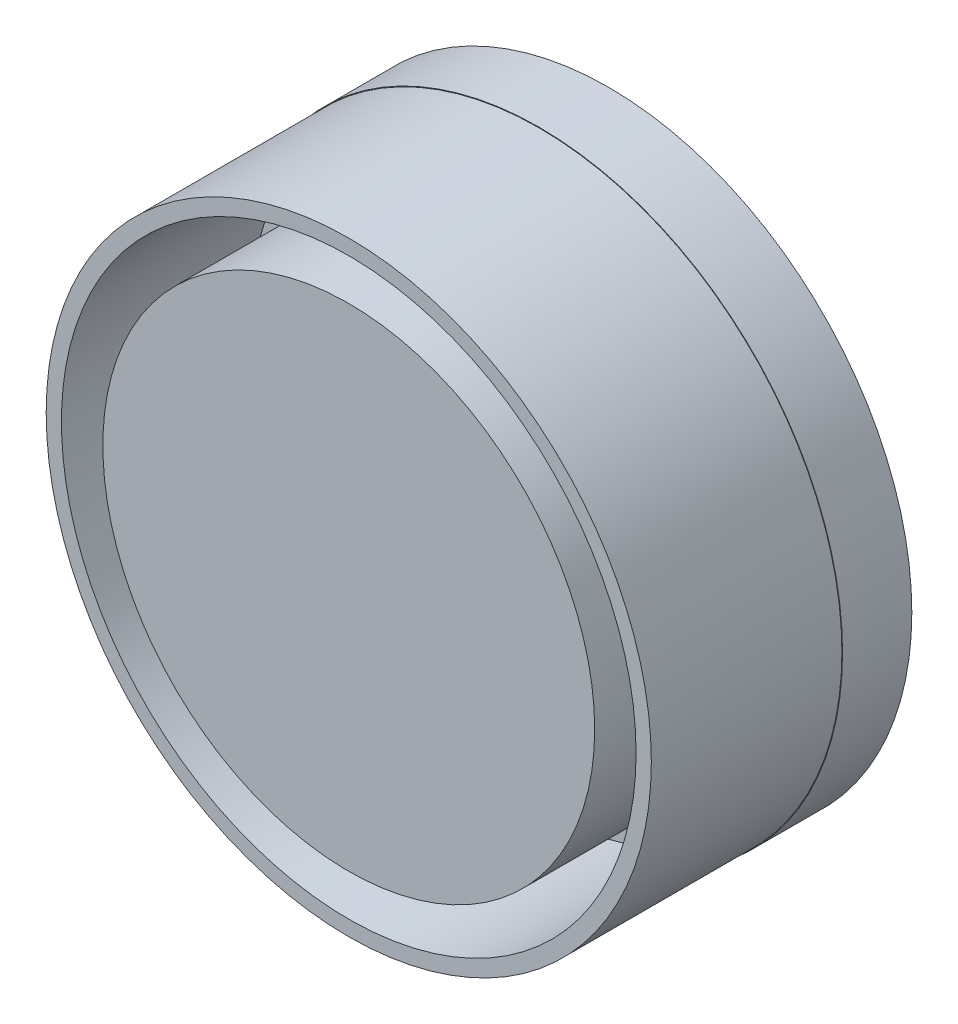
ISO-10303-21;
HEADER;
FILE_DESCRIPTION(('STEP AP214'),'2;1');
FILE_NAME('part.step','',(''),(''),'','','');
FILE_SCHEMA(('AUTOMOTIVE_DESIGN { 1 0 10303 214 1 1 1 1 }'));
ENDSEC;
DATA;
#1=APPLICATION_CONTEXT('core data for automotive mechanical design processes');
#2=APPLICATION_PROTOCOL_DEFINITION('international standard','automotive_design',2000,#1);
#3=PRODUCT_CONTEXT('',#1,'mechanical');
#4=PRODUCT('Part','Part','',(#3));
#5=PRODUCT_RELATED_PRODUCT_CATEGORY('part','',(#4));
#6=PRODUCT_DEFINITION_FORMATION('','',#4);
#7=PRODUCT_DEFINITION_CONTEXT('part definition',#1,'design');
#8=PRODUCT_DEFINITION('design','',#6,#7);
#9=PRODUCT_DEFINITION_SHAPE('','',#8);
#10=(LENGTH_UNIT() NAMED_UNIT(*) SI_UNIT(.MILLI.,.METRE.));
#11=(NAMED_UNIT(*) PLANE_ANGLE_UNIT() SI_UNIT($,.RADIAN.));
#12=(NAMED_UNIT(*) SI_UNIT($,.STERADIAN.) SOLID_ANGLE_UNIT());
#13=UNCERTAINTY_MEASURE_WITH_UNIT(LENGTH_MEASURE(1.E-05),#10,'distance_accuracy_value','');
#14=(GEOMETRIC_REPRESENTATION_CONTEXT(3) GLOBAL_UNCERTAINTY_ASSIGNED_CONTEXT((#13)) GLOBAL_UNIT_ASSIGNED_CONTEXT((#10,
#11,#12)) REPRESENTATION_CONTEXT('',''));
#15=CARTESIAN_POINT('',(0.,0.,0.));
#16=DIRECTION('',(0.,0.,1.));
#17=DIRECTION('',(1.,0.,0.));
#18=AXIS2_PLACEMENT_3D('',#15,#16,#17);
#19=CARTESIAN_POINT('',(0.,0.,19.05));
#20=DIRECTION('',(0.,0.,1.));
#21=DIRECTION('',(1.,0.,0.));
#22=AXIS2_PLACEMENT_3D('',#19,#20,#21);
#23=PLANE('',#22);
#24=CARTESIAN_POINT('',(0.,0.,19.05));
#25=DIRECTION('',(0.,0.,1.));
#26=DIRECTION('',(1.,0.,0.));
#27=AXIS2_PLACEMENT_3D('',#24,#25,#26);
#28=CIRCLE('',#27,18.0278483176293);
#29=CARTESIAN_POINT('',(18.0278483176293,0.,19.05));
#30=VERTEX_POINT('',#29);
#31=EDGE_CURVE('E17',#30,#30,#28,.F.);
#32=ORIENTED_EDGE('',*,*,#31,.F.);
#33=EDGE_LOOP('',(#32));
#34=FACE_BOUND('',#33,.T.);
#35=ADVANCED_FACE('F14',(#34),#23,.T.);
#36=CARTESIAN_POINT('',(0.,0.,5.08));
#37=DIRECTION('',(0.,0.,1.));
#38=DIRECTION('',(1.,0.,0.));
#39=AXIS2_PLACEMENT_3D('',#36,#37,#38);
#40=PLANE('',#39);
#41=CARTESIAN_POINT('',(12.7,0.,5.08));
#42=DIRECTION('',(0.,0.,-1.));
#43=DIRECTION('',(-1.,0.,0.));
#44=AXIS2_PLACEMENT_3D('',#41,#42,#43);
#45=CIRCLE('',#44,1.9812);
#46=CARTESIAN_POINT('',(10.7188,0.,5.08));
#47=VERTEX_POINT('',#46);
#48=EDGE_CURVE('E57',#47,#47,#45,.T.);
#49=ORIENTED_EDGE('',*,*,#48,.T.);
#50=EDGE_LOOP('',(#49));
#51=FACE_BOUND('',#50,.T.);
#52=ADVANCED_FACE('F67',(#51),#40,.F.);
#53=CARTESIAN_POINT('',(0.,0.,5.08));
#54=DIRECTION('',(0.,0.,1.));
#55=DIRECTION('',(1.,0.,0.));
#56=AXIS2_PLACEMENT_3D('',#53,#54,#55);
#57=PLANE('',#56);
#58=CARTESIAN_POINT('',(0.,0.,5.08));
#59=DIRECTION('',(0.,0.,-1.));
#60=DIRECTION('',(-1.,0.,0.));
#61=AXIS2_PLACEMENT_3D('',#58,#59,#60);
#62=CIRCLE('',#61,1.9812);
#63=CARTESIAN_POINT('',(-1.9812,0.,5.08));
#64=VERTEX_POINT('',#63);
#65=EDGE_CURVE('E55',#64,#64,#62,.T.);
#66=ORIENTED_EDGE('',*,*,#65,.T.);
#67=EDGE_LOOP('',(#66));
#68=FACE_BOUND('',#67,.T.);
#69=ADVANCED_FACE('F72',(#68),#57,.F.);
#70=CARTESIAN_POINT('',(0.,0.,5.08));
#71=DIRECTION('',(0.,0.,1.));
#72=DIRECTION('',(1.,0.,0.));
#73=AXIS2_PLACEMENT_3D('',#70,#71,#72);
#74=PLANE('',#73);
#75=CARTESIAN_POINT('',(-12.7,0.,5.08));
#76=DIRECTION('',(0.,0.,-1.));
#77=DIRECTION('',(-1.,0.,0.));
#78=AXIS2_PLACEMENT_3D('',#75,#76,#77);
#79=CIRCLE('',#78,1.9812);
#80=CARTESIAN_POINT('',(-14.6812,0.,5.08));
#81=VERTEX_POINT('',#80);
#82=EDGE_CURVE('E52',#81,#81,#79,.T.);
#83=ORIENTED_EDGE('',*,*,#82,.T.);
#84=EDGE_LOOP('',(#83));
#85=FACE_BOUND('',#84,.T.);
#86=ADVANCED_FACE('F118',(#85),#74,.F.);
#87=CARTESIAN_POINT('',(0.,0.,5.08));
#88=DIRECTION('',(0.,0.,1.));
#89=DIRECTION('',(1.,0.,0.));
#90=AXIS2_PLACEMENT_3D('',#87,#88,#89);
#91=CYLINDRICAL_SURFACE('',#90,18.0278483176293);
#92=CARTESIAN_POINT('',(0.,0.,5.08));
#93=DIRECTION('',(0.,0.,1.));
#94=DIRECTION('',(1.,0.,0.));
#95=AXIS2_PLACEMENT_3D('',#92,#93,#94);
#96=CIRCLE('',#95,18.0278483176293);
#97=CARTESIAN_POINT('',(18.0278483176293,0.,5.08));
#98=VERTEX_POINT('',#97);
#99=EDGE_CURVE('E49',#98,#98,#96,.F.);
#100=ORIENTED_EDGE('',*,*,#99,.F.);
#101=EDGE_LOOP('',(#100));
#102=FACE_BOUND('',#101,.T.);
#103=ORIENTED_EDGE('',*,*,#31,.T.);
#104=EDGE_LOOP('',(#103));
#105=FACE_BOUND('',#104,.T.);
#106=ADVANCED_FACE('F64',(#102,#105),#91,.T.);
#107=CARTESIAN_POINT('',(12.7,0.,63.0667218111106));
#108=DIRECTION('',(0.,0.,-1.));
#109=DIRECTION('',(-1.,0.,0.));
#110=AXIS2_PLACEMENT_3D('',#107,#108,#109);
#111=CYLINDRICAL_SURFACE('',#110,1.9812);
#112=CARTESIAN_POINT('',(12.7,0.,0.));
#113=DIRECTION('',(0.,0.,-1.));
#114=DIRECTION('',(-1.,0.,0.));
#115=AXIS2_PLACEMENT_3D('',#112,#113,#114);
#116=CIRCLE('',#115,1.9812);
#117=CARTESIAN_POINT('',(10.7188,0.,0.));
#118=VERTEX_POINT('',#117);
#119=EDGE_CURVE('E46',#118,#118,#116,.T.);
#120=ORIENTED_EDGE('',*,*,#119,.T.);
#121=EDGE_LOOP('',(#120));
#122=FACE_BOUND('',#121,.T.);
#123=ORIENTED_EDGE('',*,*,#48,.F.);
#124=EDGE_LOOP('',(#123));
#125=FACE_BOUND('',#124,.T.);
#126=ADVANCED_FACE('F111',(#122,#125),#111,.F.);
#127=CARTESIAN_POINT('',(0.,0.,63.0667218111106));
#128=DIRECTION('',(0.,0.,-1.));
#129=DIRECTION('',(-1.,0.,0.));
#130=AXIS2_PLACEMENT_3D('',#127,#128,#129);
#131=CYLINDRICAL_SURFACE('',#130,1.9812);
#132=CARTESIAN_POINT('',(0.,0.,0.));
#133=DIRECTION('',(0.,0.,-1.));
#134=DIRECTION('',(-1.,0.,0.));
#135=AXIS2_PLACEMENT_3D('',#132,#133,#134);
#136=CIRCLE('',#135,1.9812);
#137=CARTESIAN_POINT('',(-1.9812,0.,0.));
#138=VERTEX_POINT('',#137);
#139=EDGE_CURVE('E43',#138,#138,#136,.T.);
#140=ORIENTED_EDGE('',*,*,#139,.T.);
#141=EDGE_LOOP('',(#140));
#142=FACE_BOUND('',#141,.T.);
#143=ORIENTED_EDGE('',*,*,#65,.F.);
#144=EDGE_LOOP('',(#143));
#145=FACE_BOUND('',#144,.T.);
#146=ADVANCED_FACE('F107',(#142,#145),#131,.F.);
#147=CARTESIAN_POINT('',(-12.7,0.,63.0667218111106));
#148=DIRECTION('',(0.,0.,-1.));
#149=DIRECTION('',(-1.,0.,0.));
#150=AXIS2_PLACEMENT_3D('',#147,#148,#149);
#151=CYLINDRICAL_SURFACE('',#150,1.9812);
#152=CARTESIAN_POINT('',(-12.7,0.,0.));
#153=DIRECTION('',(0.,0.,-1.));
#154=DIRECTION('',(-1.,0.,0.));
#155=AXIS2_PLACEMENT_3D('',#152,#153,#154);
#156=CIRCLE('',#155,1.9812);
#157=CARTESIAN_POINT('',(-14.6812,0.,0.));
#158=VERTEX_POINT('',#157);
#159=EDGE_CURVE('E40',#158,#158,#156,.T.);
#160=ORIENTED_EDGE('',*,*,#159,.T.);
#161=EDGE_LOOP('',(#160));
#162=FACE_BOUND('',#161,.T.);
#163=ORIENTED_EDGE('',*,*,#82,.F.);
#164=EDGE_LOOP('',(#163));
#165=FACE_BOUND('',#164,.T.);
#166=ADVANCED_FACE('F103',(#162,#165),#151,.F.);
#167=CARTESIAN_POINT('',(0.,0.,5.08));
#168=DIRECTION('',(0.,0.,1.));
#169=DIRECTION('',(1.,0.,0.));
#170=AXIS2_PLACEMENT_3D('',#167,#168,#169);
#171=PLANE('',#170);
#172=ORIENTED_EDGE('',*,*,#99,.T.);
#173=EDGE_LOOP('',(#172));
#174=FACE_BOUND('',#173,.T.);
#175=CARTESIAN_POINT('',(0.,0.,5.08));
#176=DIRECTION('',(0.,0.,1.));
#177=DIRECTION('',(1.,0.,0.));
#178=AXIS2_PLACEMENT_3D('',#175,#176,#177);
#179=CIRCLE('',#178,21.06278992128);
#180=CARTESIAN_POINT('',(21.06278992128,0.,5.08));
#181=VERTEX_POINT('',#180);
#182=EDGE_CURVE('E37',#181,#181,#179,.T.);
#183=ORIENTED_EDGE('',*,*,#182,.T.);
#184=EDGE_LOOP('',(#183));
#185=FACE_BOUND('',#184,.T.);
#186=ADVANCED_FACE('F99',(#174,#185),#171,.T.);
#187=CARTESIAN_POINT('',(0.,0.,0.));
#188=DIRECTION('',(0.,0.,1.));
#189=DIRECTION('',(1.,0.,0.));
#190=AXIS2_PLACEMENT_3D('',#187,#188,#189);
#191=PLANE('',#190);
#192=ORIENTED_EDGE('',*,*,#159,.F.);
#193=EDGE_LOOP('',(#192));
#194=FACE_BOUND('',#193,.T.);
#195=ORIENTED_EDGE('',*,*,#139,.F.);
#196=EDGE_LOOP('',(#195));
#197=FACE_BOUND('',#196,.T.);
#198=ORIENTED_EDGE('',*,*,#119,.F.);
#199=EDGE_LOOP('',(#198));
#200=FACE_BOUND('',#199,.T.);
#201=CARTESIAN_POINT('',(0.,0.,0.));
#202=DIRECTION('',(0.,0.,1.));
#203=DIRECTION('',(1.,0.,0.));
#204=AXIS2_PLACEMENT_3D('',#201,#202,#203);
#205=CIRCLE('',#204,22.225);
#206=CARTESIAN_POINT('',(22.225,0.,0.));
#207=VERTEX_POINT('',#206);
#208=EDGE_CURVE('E34',#207,#207,#205,.T.);
#209=ORIENTED_EDGE('',*,*,#208,.F.);
#210=EDGE_LOOP('',(#209));
#211=FACE_BOUND('',#210,.T.);
#212=ADVANCED_FACE('F95',(#194,#197,#200,#211),#191,.F.);
#213=CARTESIAN_POINT('',(0.,0.,5.08));
#214=DIRECTION('',(0.,0.,1.));
#215=DIRECTION('',(1.,0.,0.));
#216=AXIS2_PLACEMENT_3D('',#213,#214,#215);
#217=CYLINDRICAL_SURFACE('',#216,21.06278992128);
#218=ORIENTED_EDGE('',*,*,#182,.F.);
#219=EDGE_LOOP('',(#218));
#220=FACE_BOUND('',#219,.T.);
#221=CARTESIAN_POINT('',(0.,0.,19.05));
#222=DIRECTION('',(0.,0.,1.));
#223=DIRECTION('',(1.,0.,0.));
#224=AXIS2_PLACEMENT_3D('',#221,#222,#223);
#225=CIRCLE('',#224,21.06278992128);
#226=CARTESIAN_POINT('',(21.06278992128,0.,19.05));
#227=VERTEX_POINT('',#226);
#228=EDGE_CURVE('E31',#227,#227,#225,.F.);
#229=ORIENTED_EDGE('',*,*,#228,.F.);
#230=EDGE_LOOP('',(#229));
#231=FACE_BOUND('',#230,.T.);
#232=ADVANCED_FACE('F91',(#220,#231),#217,.F.);
#233=CARTESIAN_POINT('',(0.,0.,0.));
#234=DIRECTION('',(0.,0.,1.));
#235=DIRECTION('',(1.,0.,0.));
#236=AXIS2_PLACEMENT_3D('',#233,#234,#235);
#237=CYLINDRICAL_SURFACE('',#236,22.225);
#238=ORIENTED_EDGE('',*,*,#208,.T.);
#239=EDGE_LOOP('',(#238));
#240=FACE_BOUND('',#239,.T.);
#241=CARTESIAN_POINT('',(0.,0.,5.08));
#242=DIRECTION('',(0.,0.,1.));
#243=DIRECTION('',(1.,0.,0.));
#244=AXIS2_PLACEMENT_3D('',#241,#242,#243);
#245=CIRCLE('',#244,22.225);
#246=CARTESIAN_POINT('',(22.225,0.,5.08));
#247=VERTEX_POINT('',#246);
#248=EDGE_CURVE('E26',#247,#247,#245,.T.);
#249=ORIENTED_EDGE('',*,*,#248,.F.);
#250=EDGE_LOOP('',(#249));
#251=FACE_BOUND('',#250,.T.);
#252=ADVANCED_FACE('F87',(#240,#251),#237,.T.);
#253=CARTESIAN_POINT('',(0.,0.,19.05));
#254=DIRECTION('',(0.,0.,1.));
#255=DIRECTION('',(1.,0.,0.));
#256=AXIS2_PLACEMENT_3D('',#253,#254,#255);
#257=PLANE('',#256);
#258=ORIENTED_EDGE('',*,*,#228,.T.);
#259=EDGE_LOOP('',(#258));
#260=FACE_BOUND('',#259,.T.);
#261=CARTESIAN_POINT('',(0.,0.,19.05));
#262=DIRECTION('',(0.,0.,1.));
#263=DIRECTION('',(1.,0.,0.));
#264=AXIS2_PLACEMENT_3D('',#261,#262,#263);
#265=CIRCLE('',#264,22.1804082512774);
#266=CARTESIAN_POINT('',(22.1804082512774,0.,19.05));
#267=VERTEX_POINT('',#266);
#268=EDGE_CURVE('E21',#267,#267,#265,.F.);
#269=ORIENTED_EDGE('',*,*,#268,.F.);
#270=EDGE_LOOP('',(#269));
#271=FACE_BOUND('',#270,.T.);
#272=ADVANCED_FACE('F80',(#260,#271),#257,.T.);
#273=CARTESIAN_POINT('',(0.,0.,5.08));
#274=DIRECTION('',(0.,0.,1.));
#275=DIRECTION('',(1.,0.,0.));
#276=AXIS2_PLACEMENT_3D('',#273,#274,#275);
#277=PLANE('',#276);
#278=CARTESIAN_POINT('',(0.,0.,5.08));
#279=DIRECTION('',(0.,0.,1.));
#280=DIRECTION('',(1.,0.,0.));
#281=AXIS2_PLACEMENT_3D('',#278,#279,#280);
#282=CIRCLE('',#281,22.1804082512774);
#283=CARTESIAN_POINT('',(22.1804082512774,0.,5.08));
#284=VERTEX_POINT('',#283);
#285=EDGE_CURVE('E10',#284,#284,#282,.T.);
#286=ORIENTED_EDGE('',*,*,#285,.F.);
#287=EDGE_LOOP('',(#286));
#288=FACE_BOUND('',#287,.T.);
#289=ORIENTED_EDGE('',*,*,#248,.T.);
#290=EDGE_LOOP('',(#289));
#291=FACE_BOUND('',#290,.T.);
#292=ADVANCED_FACE('F75',(#288,#291),#277,.T.);
#293=CARTESIAN_POINT('',(0.,0.,5.08));
#294=DIRECTION('',(0.,0.,1.));
#295=DIRECTION('',(1.,0.,0.));
#296=AXIS2_PLACEMENT_3D('',#293,#294,#295);
#297=CYLINDRICAL_SURFACE('',#296,22.1804082512774);
#298=ORIENTED_EDGE('',*,*,#285,.T.);
#299=EDGE_LOOP('',(#298));
#300=FACE_BOUND('',#299,.T.);
#301=ORIENTED_EDGE('',*,*,#268,.T.);
#302=EDGE_LOOP('',(#301));
#303=FACE_BOUND('',#302,.T.);
#304=ADVANCED_FACE('F73',(#300,#303),#297,.T.);
#305=CLOSED_SHELL('',(#35,#52,#69,#86,#106,#126,#146,#166,#186,#212,#232,#252,#272,#292,#304));
#306=MANIFOLD_SOLID_BREP('B1',#305);
#307=ADVANCED_BREP_SHAPE_REPRESENTATION('',(#18,#306),#14);
#308=SHAPE_DEFINITION_REPRESENTATION(#9,#307);
ENDSEC;
END-ISO-10303-21;
